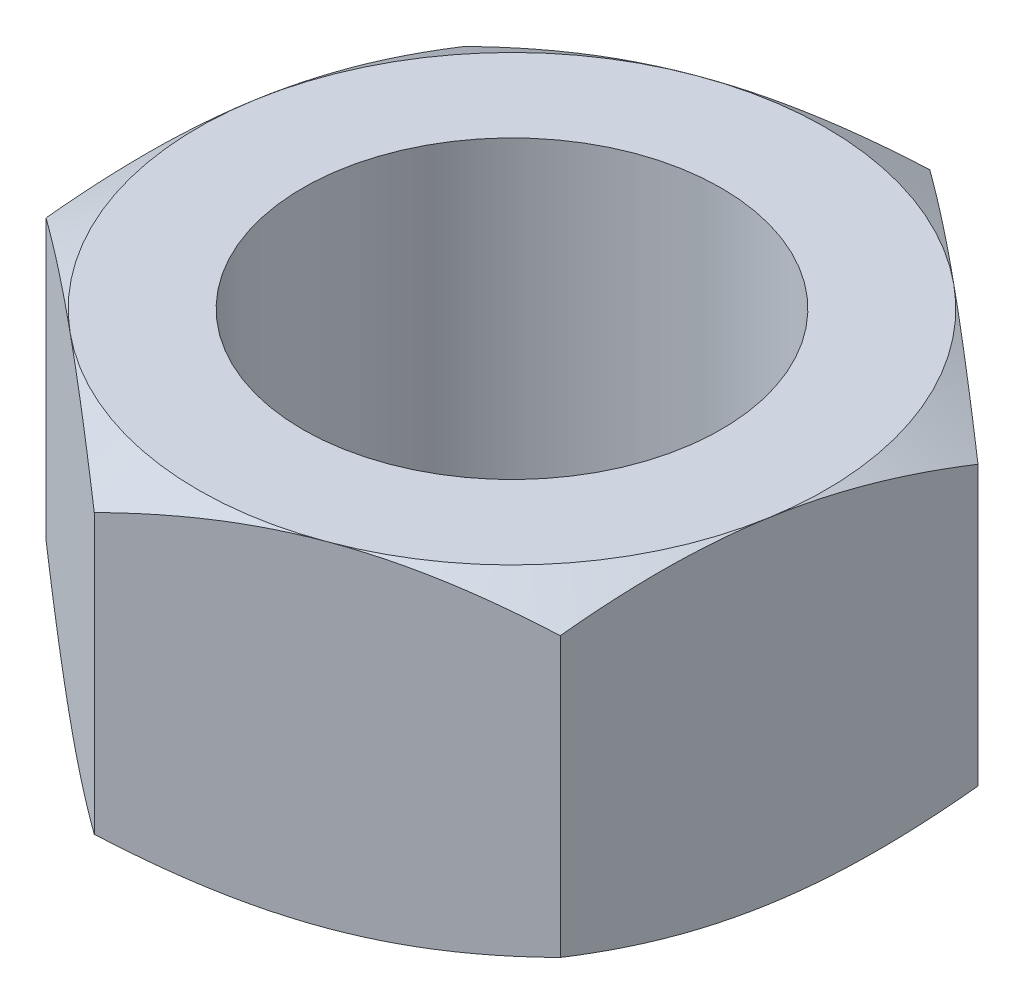
ISO-10303-21;
HEADER;
FILE_DESCRIPTION(('STEP AP214'),'2;1');
FILE_NAME('part.step','',(''),(''),'','','');
FILE_SCHEMA(('AUTOMOTIVE_DESIGN { 1 0 10303 214 1 1 1 1 }'));
ENDSEC;
DATA;
#1=APPLICATION_CONTEXT('core data for automotive mechanical design processes');
#2=APPLICATION_PROTOCOL_DEFINITION('international standard','automotive_design',2000,#1);
#3=PRODUCT_CONTEXT('',#1,'mechanical');
#4=PRODUCT('Part','Part','',(#3));
#5=PRODUCT_RELATED_PRODUCT_CATEGORY('part','',(#4));
#6=PRODUCT_DEFINITION_FORMATION('','',#4);
#7=PRODUCT_DEFINITION_CONTEXT('part definition',#1,'design');
#8=PRODUCT_DEFINITION('design','',#6,#7);
#9=PRODUCT_DEFINITION_SHAPE('','',#8);
#10=(LENGTH_UNIT() NAMED_UNIT(*) SI_UNIT(.MILLI.,.METRE.));
#11=(NAMED_UNIT(*) PLANE_ANGLE_UNIT() SI_UNIT($,.RADIAN.));
#12=(NAMED_UNIT(*) SI_UNIT($,.STERADIAN.) SOLID_ANGLE_UNIT());
#13=UNCERTAINTY_MEASURE_WITH_UNIT(LENGTH_MEASURE(1.E-05),#10,'distance_accuracy_value','');
#14=(GEOMETRIC_REPRESENTATION_CONTEXT(3) GLOBAL_UNCERTAINTY_ASSIGNED_CONTEXT((#13)) GLOBAL_UNIT_ASSIGNED_CONTEXT((#10,
#11,#12)) REPRESENTATION_CONTEXT('',''));
#15=CARTESIAN_POINT('',(0.,0.,0.));
#16=DIRECTION('',(0.,0.,1.));
#17=DIRECTION('',(1.,0.,0.));
#18=AXIS2_PLACEMENT_3D('',#15,#16,#17);
#19=CARTESIAN_POINT('',(-1.44369467023749,8.,8.53907171179209));
#20=DIRECTION('',(-0.34863406811952,0.,-0.937258921828133));
#21=DIRECTION('',(-0.937258921828133,0.,0.34863406811952));
#22=AXIS2_PLACEMENT_3D('',#19,#20,#21);
#23=PLANE('',#22);
#24=CARTESIAN_POINT('',(6.67340569203028,0.669934582085275,5.51973772123151));
#25=CARTESIAN_POINT('',(6.49498732644152,0.61499041368803,5.58610435607892));
#26=CARTESIAN_POINT('',(6.31590373120375,0.562539844764627,5.65271843772397));
#27=CARTESIAN_POINT('',(5.95628219341445,0.463312688605474,5.78648757748136));
#28=CARTESIAN_POINT('',(5.77574365902302,0.416538549046466,5.85364285574156));
#29=CARTESIAN_POINT('',(5.23123744179099,0.285648891076474,6.05618391799114));
#30=CARTESIAN_POINT('',(4.86512041892743,0.211200490063354,6.19236919627024));
#31=CARTESIAN_POINT('',(4.31723296252882,0.123901221271782,6.39616798478786));
#32=CARTESIAN_POINT('',(4.13709953241467,0.0990322370979437,6.46317257560309));
#33=CARTESIAN_POINT('',(3.77601876178583,0.0573306993877993,6.59748450910651));
#34=CARTESIAN_POINT('',(3.59507149461047,0.0404974357964017,6.66479182451452));
#35=CARTESIAN_POINT('',(3.23286270958824,0.0152963397422831,6.79952334777878));
#36=CARTESIAN_POINT('',(3.05160178328159,0.00691890019796405,6.86694733559865));
#37=CARTESIAN_POINT('',(2.68892251831363,-0.00119990207370901,7.0018538642255));
#38=CARTESIAN_POINT('',(2.50750418468866,-0.000941531608342203,7.0693364031591));
#39=CARTESIAN_POINT('',(2.01048216082673,0.0116366203444909,7.25421467541497));
#40=CARTESIAN_POINT('',(1.69504118336627,0.032750367326311,7.37154988414164));
#41=CARTESIAN_POINT('',(1.06625435166348,0.0997010500425559,7.60544097443817));
#42=CARTESIAN_POINT('',(0.752910708611471,0.145560867086196,7.72199603350715));
#43=CARTESIAN_POINT('',(0.122858541479935,0.260196634976687,7.95635779314358));
#44=CARTESIAN_POINT('',(-0.19377048564775,0.32945826489346,8.0741349230715));
#45=CARTESIAN_POINT('',(-0.822306823607496,0.486654039468555,8.30793283671146));
#46=CARTESIAN_POINT('',(-1.13422218333332,0.574551261711175,8.42395661438654));
#47=CARTESIAN_POINT('',(-1.44389467023749,0.669934582085275,8.53914610619048));
#48=B_SPLINE_CURVE_WITH_KNOTS('',3,(#24,#25,#26,#27,#28,#29,#30,#31,#32,#33,#34,#35,#36,#37,#38,
#39,#40,#41,#42,#43,#44,#45,#46,#47),.UNSPECIFIED.,.F.,.F.,(4,2,2,2,2,2,2,2,2,2,2,4),(0.,
0.594350167566524,1.18895571516085,2.38063749631713,2.96188394546358,3.54307902480116,
4.12361303374696,4.70412910684701,5.71472439101079,6.7262557214494,7.76022088252539,
8.79215629474527),.UNSPECIFIED.);
#49=CARTESIAN_POINT('',(6.67320569203028,0.669872981077802,5.5198121156299));
#50=VERTEX_POINT('',#49);
#51=CARTESIAN_POINT('',(2.6147555108964,0.,7.029441913711));
#52=VERTEX_POINT('',#51);
#53=EDGE_CURVE('E131',#50,#52,#48,.T.);
#54=ORIENTED_EDGE('',*,*,#53,.F.);
#55=DIRECTION('',(0.,-1.,0.));
#56=VECTOR('',#55,1.);
#57=CARTESIAN_POINT('',(6.67320569203028,8.,5.5198121156299));
#58=LINE('',#57,#56);
#59=CARTESIAN_POINT('',(6.67320569203028,7.3301270189222,5.5198121156299));
#60=VERTEX_POINT('',#59);
#61=EDGE_CURVE('E262',#60,#50,#58,.T.);
#62=ORIENTED_EDGE('',*,*,#61,.F.);
#63=CARTESIAN_POINT('',(-1.44389467023749,7.33006541791473,8.53914610619048));
#64=CARTESIAN_POINT('',(-1.26547630464873,7.38500958631197,8.47277947134307));
#65=CARTESIAN_POINT('',(-1.08639270941096,7.43746015523537,8.40616538969802));
#66=CARTESIAN_POINT('',(-0.726771171621659,7.53668731139453,8.27239624994063));
#67=CARTESIAN_POINT('',(-0.54623263723023,7.58346145095353,8.20524097168044));
#68=CARTESIAN_POINT('',(-0.00172641999819791,7.71435110892353,8.00269990943085));
#69=CARTESIAN_POINT('',(0.364390602865364,7.78879950993665,7.86651463115175));
#70=CARTESIAN_POINT('',(0.912278059263968,7.87609877872822,7.66271584263413));
#71=CARTESIAN_POINT('',(1.09241148937812,7.90096776290206,7.5957112518189));
#72=CARTESIAN_POINT('',(1.45349226000696,7.9426693006122,7.46139931831548));
#73=CARTESIAN_POINT('',(1.63443952718232,7.9595025642036,7.39409200290748));
#74=CARTESIAN_POINT('',(1.99664831220455,7.98470366025772,7.25936047964321));
#75=CARTESIAN_POINT('',(2.1779092385112,7.99308109980204,7.19193649182334));
#76=CARTESIAN_POINT('',(2.54058850347916,8.00119990207371,7.0570299631965));
#77=CARTESIAN_POINT('',(2.72200683710413,8.00094153160834,6.98954742426289));
#78=CARTESIAN_POINT('',(3.21902886096606,7.98836337965551,6.80466915200702));
#79=CARTESIAN_POINT('',(3.53446983842652,7.96724963267369,6.68733394328035));
#80=CARTESIAN_POINT('',(4.16325667012932,7.90029894995745,6.45344285298383));
#81=CARTESIAN_POINT('',(4.47660031318132,7.85443913291381,6.33688779391484));
#82=CARTESIAN_POINT('',(5.10665248031286,7.73980336502331,6.10252603427841));
#83=CARTESIAN_POINT('',(5.42328150744054,7.67054173510654,5.98474890435049));
#84=CARTESIAN_POINT('',(6.05181784540029,7.51334596053145,5.75095099071054));
#85=CARTESIAN_POINT('',(6.36373320512611,7.42544873828883,5.63492721303545));
#86=CARTESIAN_POINT('',(6.67340569203028,7.33006541791473,5.51973772123151));
#87=B_SPLINE_CURVE_WITH_KNOTS('',3,(#63,#64,#65,#66,#67,#68,#69,#70,#71,#72,#73,#74,#75,#76,#77,
#78,#79,#80,#81,#82,#83,#84,#85,#86),.UNSPECIFIED.,.F.,.F.,(4,2,2,2,2,2,2,2,2,2,2,4),(0.,
0.594350167566525,1.18895571516085,2.38063749631713,2.96188394546358,3.54307902480116,
4.12361303374695,4.704129106847,5.71472439101079,6.7262557214494,7.76022088252539,
8.79215629474526),.UNSPECIFIED.);
#88=CARTESIAN_POINT('',(2.6147555108964,8.,7.029441913711));
#89=VERTEX_POINT('',#88);
#90=EDGE_CURVE('E242',#89,#60,#87,.T.);
#91=ORIENTED_EDGE('',*,*,#90,.F.);
#92=CARTESIAN_POINT('',(-1.44369467023749,7.3301270189222,8.53907171179209));
#93=VERTEX_POINT('',#92);
#94=EDGE_CURVE('E248',#93,#89,#87,.T.);
#95=ORIENTED_EDGE('',*,*,#94,.F.);
#96=DIRECTION('',(0.,-1.,0.));
#97=VECTOR('',#96,1.);
#98=CARTESIAN_POINT('',(-1.44369467023749,8.,8.53907171179209));
#99=LINE('',#98,#97);
#100=CARTESIAN_POINT('',(-1.44369467023749,0.669872981077804,8.53907171179209));
#101=VERTEX_POINT('',#100);
#102=EDGE_CURVE('E161',#93,#101,#99,.T.);
#103=ORIENTED_EDGE('',*,*,#102,.T.);
#104=EDGE_CURVE('E143',#52,#101,#48,.T.);
#105=ORIENTED_EDGE('',*,*,#104,.F.);
#106=EDGE_LOOP('',(#54,#62,#91,#95,#103,#105));
#107=FACE_BOUND('',#106,.T.);
#108=ADVANCED_FACE('F41',(#107),#23,.F.);
#109=CARTESIAN_POINT('',(6.67320569203028,8.,5.5198121156299));
#110=DIRECTION('',(-0.986007070286536,0.,-0.166703501297848));
#111=DIRECTION('',(-0.166703501297848,0.,0.986007070286536));
#112=AXIS2_PLACEMENT_3D('',#109,#110,#111);
#113=PLANE('',#112);
#114=CARTESIAN_POINT('',(8.11693417612292,0.669931536480535,-3.01945959616219));
#115=CARTESIAN_POINT('',(8.08520019987834,0.614987494088027,-2.83176152922384));
#116=CARTESIAN_POINT('',(8.05334790409476,0.562537054216301,-2.64336363354107));
#117=CARTESIAN_POINT('',(7.98938463854219,0.463310161762978,-2.26503785404366));
#118=CARTESIAN_POINT('',(7.95727356350703,0.416536156859956,-2.07510934760759));
#119=CARTESIAN_POINT('',(7.86042620741353,0.285646912260097,-1.50228287963715));
#120=CARTESIAN_POINT('',(7.79530763940616,0.211198797092288,-1.1171237920216));
#121=CARTESIAN_POINT('',(7.69785888875528,0.123899954229493,-0.54074023448197));
#122=CARTESIAN_POINT('',(7.66581986681431,0.0990311093659153,-0.351237903019766));
#123=CARTESIAN_POINT('',(7.60159705945798,0.0573298489513181,0.0286229975251618));
#124=CARTESIAN_POINT('',(7.56941328708685,0.0404967233463565,0.218981489454664));
#125=CARTESIAN_POINT('',(7.50498984963335,0.01529589836571,0.600029063901351));
#126=CARTESIAN_POINT('',(7.47275028976229,0.00691859196391458,0.790717524121497));
#127=CARTESIAN_POINT('',(7.40824317319374,-0.00119995198440781,1.17226003837705));
#128=CARTESIAN_POINT('',(7.37597561739202,-0.000941456342233855,1.36311408711426));
#129=CARTESIAN_POINT('',(7.2875741645718,0.0116369901313172,1.88598527353643));
#130=CARTESIAN_POINT('',(7.23146920871259,0.0327507878641885,2.21783123192727));
#131=CARTESIAN_POINT('',(7.11963193933104,0.0997013333310603,2.87931906795497));
#132=CARTESIAN_POINT('',(7.06390001908873,0.145560961828871,3.20895861944455));
#133=CARTESIAN_POINT('',(6.95183769884847,0.260196141216312,3.87177757171231));
#134=CARTESIAN_POINT('',(6.89552143817182,0.329457363606809,4.20487334214886));
#135=CARTESIAN_POINT('',(6.78372872548718,0.486652168279931,4.86609763711207));
#136=CARTESIAN_POINT('',(6.72825084191222,0.574548828915974,5.19423462897829));
#137=CARTESIAN_POINT('',(6.67317187817512,0.669931536480536,5.5200121156299));
#138=B_SPLINE_CURVE_WITH_KNOTS('',3,(#114,#115,#116,#117,#118,#119,#120,#121,#122,#123,#124,
#125,#126,#127,#128,#129,#130,#131,#132,#133,#134,#135,#136,#137),.UNSPECIFIED.,.F.,.F.,(4,2,2,
2,2,2,2,2,2,2,2,4),(0.,0.594349806644114,1.1889549931035,2.380636032122,2.96188215456027,
3.54307690729336,4.12361059346092,4.70412634350593,5.71471695893529,6.72624360304106,
7.76020382983172,8.79213434275382),.UNSPECIFIED.);
#139=CARTESIAN_POINT('',(8.11690036226776,0.669872981077801,-3.01925959616219));
#140=VERTEX_POINT('',#139);
#141=CARTESIAN_POINT('',(7.39505302714902,0.,1.25027625973386));
#142=VERTEX_POINT('',#141);
#143=EDGE_CURVE('E58',#140,#142,#138,.T.);
#144=ORIENTED_EDGE('',*,*,#143,.F.);
#145=DIRECTION('',(0.,-1.,0.));
#146=VECTOR('',#145,1.);
#147=CARTESIAN_POINT('',(8.11690036226776,8.,-3.01925959616219));
#148=LINE('',#147,#146);
#149=CARTESIAN_POINT('',(8.11690036226776,7.3301270189222,-3.01925959616219));
#150=VERTEX_POINT('',#149);
#151=EDGE_CURVE('E259',#150,#140,#148,.T.);
#152=ORIENTED_EDGE('',*,*,#151,.F.);
#153=CARTESIAN_POINT('',(6.67317187817512,7.33006846351947,5.5200121156299));
#154=CARTESIAN_POINT('',(6.7049058544197,7.38501250591197,5.33231404869155));
#155=CARTESIAN_POINT('',(6.73675815020328,7.4374629457837,5.14391615300878));
#156=CARTESIAN_POINT('',(6.80072141575585,7.53668983823702,4.76559037351137));
#157=CARTESIAN_POINT('',(6.83283249079101,7.58346384314005,4.57566186707531));
#158=CARTESIAN_POINT('',(6.92967984688451,7.71435308773991,4.00283539910487));
#159=CARTESIAN_POINT('',(6.99479841489188,7.78880120290771,3.61767631148931));
#160=CARTESIAN_POINT('',(7.09224716554276,7.87610004577051,3.04129275394969));
#161=CARTESIAN_POINT('',(7.12428618748373,7.90096889063409,2.85179042248748));
#162=CARTESIAN_POINT('',(7.18850899484006,7.94267015104868,2.47192952194255));
#163=CARTESIAN_POINT('',(7.22069276721119,7.95950327665365,2.28157103001305));
#164=CARTESIAN_POINT('',(7.28511620466469,7.98470410163429,1.90052345556636));
#165=CARTESIAN_POINT('',(7.31735576453575,7.99308140803609,1.70983499534622));
#166=CARTESIAN_POINT('',(7.3818628811043,8.00119995198441,1.32829248109066));
#167=CARTESIAN_POINT('',(7.41413043690602,8.00094145634224,1.13743843235345));
#168=CARTESIAN_POINT('',(7.50253188972624,7.98836300986868,0.614567245931289));
#169=CARTESIAN_POINT('',(7.55863684558545,7.96724921213581,0.282721287540443));
#170=CARTESIAN_POINT('',(7.670474114967,7.90029866666894,-0.378766548487257));
#171=CARTESIAN_POINT('',(7.72620603520931,7.85443903817113,-0.708406099976839));
#172=CARTESIAN_POINT('',(7.83826835544957,7.73980385878369,-1.3712250522446));
#173=CARTESIAN_POINT('',(7.89458461612622,7.67054263639319,-1.70432082268115));
#174=CARTESIAN_POINT('',(8.00637732881086,7.51334783172007,-2.36554511764435));
#175=CARTESIAN_POINT('',(8.06185521238582,7.42545117108403,-2.69368210951058));
#176=CARTESIAN_POINT('',(8.11693417612292,7.33006846351947,-3.01945959616219));
#177=B_SPLINE_CURVE_WITH_KNOTS('',3,(#153,#154,#155,#156,#157,#158,#159,#160,#161,#162,#163,
#164,#165,#166,#167,#168,#169,#170,#171,#172,#173,#174,#175,#176),.UNSPECIFIED.,.F.,.F.,(4,2,2,
2,2,2,2,2,2,2,2,4),(0.,0.594349806644116,1.18895499310351,2.380636032122,2.96188215456027,
3.54307690729336,4.12361059346092,4.70412634350593,5.71471695893529,6.72624360304106,
7.76020382983172,8.79213434275382),.UNSPECIFIED.);
#178=CARTESIAN_POINT('',(7.39505302714903,8.,1.25027625973386));
#179=VERTEX_POINT('',#178);
#180=EDGE_CURVE('E227',#179,#150,#177,.T.);
#181=ORIENTED_EDGE('',*,*,#180,.F.);
#182=EDGE_CURVE('E234',#60,#179,#177,.T.);
#183=ORIENTED_EDGE('',*,*,#182,.F.);
#184=ORIENTED_EDGE('',*,*,#61,.T.);
#185=EDGE_CURVE('E137',#142,#50,#138,.T.);
#186=ORIENTED_EDGE('',*,*,#185,.F.);
#187=EDGE_LOOP('',(#144,#152,#181,#183,#184,#186));
#188=FACE_BOUND('',#187,.T.);
#189=ADVANCED_FACE('F219',(#188),#113,.F.);
#190=CARTESIAN_POINT('',(8.11690036226776,8.,-3.01925959616219));
#191=DIRECTION('',(-0.637373002167017,0.,0.770555420530285));
#192=DIRECTION('',(0.770555420530285,0.,0.637373002167017));
#193=AXIS2_PLACEMENT_3D('',#190,#191,#192);
#194=PLANE('',#193);
#195=CARTESIAN_POINT('',(1.44349467023748,0.669947909270021,-8.53923714389085));
#196=CARTESIAN_POINT('',(1.59017934429502,0.615003189494996,-8.41790537646055));
#197=CARTESIAN_POINT('',(1.73741092985964,0.56255205586088,-8.29612122543796));
#198=CARTESIAN_POINT('',(2.03306978023781,0.463323745764642,-8.05156390475479));
#199=CARTESIAN_POINT('',(2.18149753162802,0.416549016971252,-7.9287903326172));
#200=CARTESIAN_POINT('',(2.62915730228068,0.2856575501553,-7.55850385565761));
#201=CARTESIAN_POINT('',(2.93015638802545,0.211207898325488,-7.30952930325144));
#202=CARTESIAN_POINT('',(3.38059604417727,0.123906765731987,-6.93694341482957));
#203=CARTESIAN_POINT('',(3.52869074651668,0.0990371719568291,-6.81444532770932));
#204=CARTESIAN_POINT('',(3.82554931567242,0.0573344208415768,-6.56889564704964));
#205=CARTESIAN_POINT('',(3.97431312219173,0.0405005534413595,-6.44584410338552));
#206=CARTESIAN_POINT('',(4.27209910847214,0.0152982712082999,-6.19952729991901));
#207=CARTESIAN_POINT('',(4.42112080187179,0.00692024905105385,-6.0762624424156));
#208=CARTESIAN_POINT('',(4.71929362297594,-0.00119968360760581,-5.82962566446526));
#209=CARTESIAN_POINT('',(4.86844474653955,-0.000941860898707517,-5.7062537474435));
#210=CARTESIAN_POINT('',(5.27707067658354,0.011635002250856,-5.36825452135774));
#211=CARTESIAN_POINT('',(5.53641172314485,0.0327485271370408,-5.15373785321444));
#212=CARTESIAN_POINT('',(6.05337129392387,0.0996998104171765,-4.72612931936019));
#213=CARTESIAN_POINT('',(6.31098800006821,0.14556045250706,-4.51303895748772));
#214=CARTESIAN_POINT('',(6.82898795637013,0.260198795605914,-4.08456985783058));
#215=CARTESIAN_POINT('',(7.0893058444828,0.329462208806821,-3.86924518494727));
#216=CARTESIAN_POINT('',(7.60605953930169,0.486662227553499,-3.44180694355387));
#217=CARTESIAN_POINT('',(7.86250196394722,0.574561907317877,-3.22968790094584));
#218=CARTESIAN_POINT('',(8.11710036226776,0.66994790927002,-3.01909416406342));
#219=B_SPLINE_CURVE_WITH_KNOTS('',3,(#195,#196,#197,#198,#199,#200,#201,#202,#203,#204,#205,
#206,#207,#208,#209,#210,#211,#212,#213,#214,#215,#216,#217,#218),.UNSPECIFIED.,.F.,.F.,(4,2,2,
2,2,2,2,2,2,2,2,4),(0.,0.594351746917321,1.18895887479238,2.38064390344968,2.96189178223027,
3.54308829074832,4.12362371213127,4.70414119887973,5.71475691272487,6.72630874985524,
7.76029550264454,8.792252353473),.UNSPECIFIED.);
#220=CARTESIAN_POINT('',(1.44369467023748,0.669872981077803,-8.53907171179209));
#221=VERTEX_POINT('',#220);
#222=CARTESIAN_POINT('',(4.78029751625262,0.,-5.77916565397714));
#223=VERTEX_POINT('',#222);
#224=EDGE_CURVE('E65',#221,#223,#219,.T.);
#225=ORIENTED_EDGE('',*,*,#224,.F.);
#226=DIRECTION('',(0.,-1.,0.));
#227=VECTOR('',#226,1.);
#228=CARTESIAN_POINT('',(1.44369467023748,8.,-8.53907171179209));
#229=LINE('',#228,#227);
#230=CARTESIAN_POINT('',(1.44369467023748,7.3301270189222,-8.53907171179209));
#231=VERTEX_POINT('',#230);
#232=EDGE_CURVE('E256',#231,#221,#229,.T.);
#233=ORIENTED_EDGE('',*,*,#232,.F.);
#234=CARTESIAN_POINT('',(8.11710036226776,7.33005209072998,-3.01909416406342));
#235=CARTESIAN_POINT('',(7.97041568821022,7.38499681050501,-3.14042593149373));
#236=CARTESIAN_POINT('',(7.82318410264561,7.43744794413912,-3.26221008251631));
#237=CARTESIAN_POINT('',(7.52752525226744,7.53667625423536,-3.50676740319948));
#238=CARTESIAN_POINT('',(7.37909750087722,7.58345098302875,-3.62954097533707));
#239=CARTESIAN_POINT('',(6.93143773022457,7.7143424498447,-3.99982745229667));
#240=CARTESIAN_POINT('',(6.63043864447979,7.78879210167451,-4.24880200470283));
#241=CARTESIAN_POINT('',(6.17999898832797,7.87609323426802,-4.62138789312471));
#242=CARTESIAN_POINT('',(6.03190428598856,7.90096282804317,-4.74388598024496));
#243=CARTESIAN_POINT('',(5.73504571683282,7.94266557915843,-4.98943566090464));
#244=CARTESIAN_POINT('',(5.58628191031352,7.95949944655864,-5.11248720456875));
#245=CARTESIAN_POINT('',(5.28849592403311,7.9847017287917,-5.35880400803526));
#246=CARTESIAN_POINT('',(5.13947423063345,7.99307975094895,-5.48206886553868));
#247=CARTESIAN_POINT('',(4.8413014095293,8.00119968360761,-5.72870564348902));
#248=CARTESIAN_POINT('',(4.69215028596569,8.00094186089871,-5.85207756051077));
#249=CARTESIAN_POINT('',(4.2835243559217,7.98836499774915,-6.19007678659654));
#250=CARTESIAN_POINT('',(4.02418330936039,7.96725147286296,-6.40459345473984));
#251=CARTESIAN_POINT('',(3.50722373858137,7.90030018958282,-6.83220198859408));
#252=CARTESIAN_POINT('',(3.24960703243704,7.85443954749294,-7.04529235046655));
#253=CARTESIAN_POINT('',(2.73160707613511,7.73980120439409,-7.47376145012369));
#254=CARTESIAN_POINT('',(2.47128918802245,7.67053779119318,-7.68908612300701));
#255=CARTESIAN_POINT('',(1.95453549320356,7.5133377724465,-8.1165243644004));
#256=CARTESIAN_POINT('',(1.69809306855803,7.42543809268213,-8.32864340700843));
#257=CARTESIAN_POINT('',(1.44349467023748,7.33005209072998,-8.53923714389085));
#258=B_SPLINE_CURVE_WITH_KNOTS('',3,(#234,#235,#236,#237,#238,#239,#240,#241,#242,#243,#244,
#245,#246,#247,#248,#249,#250,#251,#252,#253,#254,#255,#256,#257),.UNSPECIFIED.,.F.,.F.,(4,2,2,
2,2,2,2,2,2,2,2,4),(0.,0.594351746917323,1.18895887479238,2.38064390344967,2.96189178223027,
3.54308829074832,4.12362371213127,4.70414119887973,5.71475691272487,6.72630874985524,
7.76029550264454,8.79225235347299),.UNSPECIFIED.);
#259=CARTESIAN_POINT('',(4.78029751625262,8.,-5.77916565397714));
#260=VERTEX_POINT('',#259);
#261=EDGE_CURVE('E236',#260,#231,#258,.T.);
#262=ORIENTED_EDGE('',*,*,#261,.F.);
#263=EDGE_CURVE('E235',#150,#260,#258,.T.);
#264=ORIENTED_EDGE('',*,*,#263,.F.);
#265=ORIENTED_EDGE('',*,*,#151,.T.);
#266=EDGE_CURVE('E212',#223,#140,#219,.T.);
#267=ORIENTED_EDGE('',*,*,#266,.F.);
#268=EDGE_LOOP('',(#225,#233,#262,#264,#265,#267));
#269=FACE_BOUND('',#268,.T.);
#270=ADVANCED_FACE('F222',(#269),#194,.F.);
#271=CARTESIAN_POINT('',(1.44369467023748,8.,-8.53907171179209));
#272=DIRECTION('',(0.34863406811952,0.,0.937258921828133));
#273=DIRECTION('',(0.937258921828133,0.,-0.34863406811952));
#274=AXIS2_PLACEMENT_3D('',#271,#272,#273);
#275=PLANE('',#274);
#276=CARTESIAN_POINT('',(-6.67340569203028,0.669934582085276,-5.51973772123152));
#277=CARTESIAN_POINT('',(-6.49498732644152,0.614990413688031,-5.58610435607893));
#278=CARTESIAN_POINT('',(-6.31590373120376,0.562539844764629,-5.65271843772398));
#279=CARTESIAN_POINT('',(-5.95628219341445,0.463312688605475,-5.78648757748136));
#280=CARTESIAN_POINT('',(-5.77574365902302,0.416538549046468,-5.85364285574156));
#281=CARTESIAN_POINT('',(-5.23123744179099,0.285648891076476,-6.05618391799115));
#282=CARTESIAN_POINT('',(-4.86512041892743,0.211200490063354,-6.19236919627024));
#283=CARTESIAN_POINT('',(-4.31723296252883,0.123901221271783,-6.39616798478786));
#284=CARTESIAN_POINT('',(-4.13709953241468,0.0990322370979448,-6.46317257560309));
#285=CARTESIAN_POINT('',(-3.77601876178583,0.0573306993878005,-6.59748450910651));
#286=CARTESIAN_POINT('',(-3.59507149461047,0.0404974357964028,-6.66479182451452));
#287=CARTESIAN_POINT('',(-3.23286270958824,0.0152963397422842,-6.79952334777878));
#288=CARTESIAN_POINT('',(-3.05160178328159,0.00691890019796537,-6.86694733559865));
#289=CARTESIAN_POINT('',(-2.68892251831363,-0.00119990207370781,-7.0018538642255));
#290=CARTESIAN_POINT('',(-2.50750418468866,-0.00094153160834132,-7.0693364031591));
#291=CARTESIAN_POINT('',(-2.01048216082673,0.0116366203444915,-7.25421467541497));
#292=CARTESIAN_POINT('',(-1.69504118336627,0.0327503673263118,-7.37154988414164));
#293=CARTESIAN_POINT('',(-1.06625435166348,0.0997010500425568,-7.60544097443817));
#294=CARTESIAN_POINT('',(-0.752910708611473,0.145560867086196,-7.72199603350715));
#295=CARTESIAN_POINT('',(-0.122858541479938,0.260196634976688,-7.95635779314358));
#296=CARTESIAN_POINT('',(0.193770485647746,0.329458264893461,-8.0741349230715));
#297=CARTESIAN_POINT('',(0.822306823607491,0.486654039468555,-8.30793283671146));
#298=CARTESIAN_POINT('',(1.13422218333331,0.574551261711174,-8.42395661438654));
#299=CARTESIAN_POINT('',(1.44389467023748,0.669934582085274,-8.53914610619048));
#300=B_SPLINE_CURVE_WITH_KNOTS('',3,(#276,#277,#278,#279,#280,#281,#282,#283,#284,#285,#286,
#287,#288,#289,#290,#291,#292,#293,#294,#295,#296,#297,#298,#299),.UNSPECIFIED.,.F.,.F.,(4,2,2,
2,2,2,2,2,2,2,2,4),(0.,0.594350167566525,1.18895571516085,2.38063749631713,2.96188394546358,
3.54307902480116,4.12361303374696,4.70412910684701,5.71472439101079,6.7262557214494,
7.76022088252539,8.79215629474526),.UNSPECIFIED.);
#301=CARTESIAN_POINT('',(-6.67320569203028,0.669872981077804,-5.5198121156299));
#302=VERTEX_POINT('',#301);
#303=CARTESIAN_POINT('',(-2.6147555108964,0.,-7.029441913711));
#304=VERTEX_POINT('',#303);
#305=EDGE_CURVE('E176',#302,#304,#300,.T.);
#306=ORIENTED_EDGE('',*,*,#305,.F.);
#307=DIRECTION('',(0.,-1.,0.));
#308=VECTOR('',#307,1.);
#309=CARTESIAN_POINT('',(-6.67320569203028,8.,-5.5198121156299));
#310=LINE('',#309,#308);
#311=CARTESIAN_POINT('',(-6.67320569203028,7.3301270189222,-5.5198121156299));
#312=VERTEX_POINT('',#311);
#313=EDGE_CURVE('E253',#312,#302,#310,.T.);
#314=ORIENTED_EDGE('',*,*,#313,.F.);
#315=CARTESIAN_POINT('',(1.44389467023748,7.33006541791473,-8.53914610619048));
#316=CARTESIAN_POINT('',(1.26547630464873,7.38500958631197,-8.47277947134307));
#317=CARTESIAN_POINT('',(1.08639270941096,7.43746015523537,-8.40616538969802));
#318=CARTESIAN_POINT('',(0.726771171621654,7.53668731139453,-8.27239624994063));
#319=CARTESIAN_POINT('',(0.546232637230224,7.58346145095354,-8.20524097168044));
#320=CARTESIAN_POINT('',(0.00172641999819325,7.71435110892353,-8.00269990943085));
#321=CARTESIAN_POINT('',(-0.364390602865369,7.78879950993665,-7.86651463115175));
#322=CARTESIAN_POINT('',(-0.912278059263972,7.87609877872822,-7.66271584263413));
#323=CARTESIAN_POINT('',(-1.09241148937812,7.90096776290206,-7.5957112518189));
#324=CARTESIAN_POINT('',(-1.45349226000697,7.9426693006122,-7.46139931831548));
#325=CARTESIAN_POINT('',(-1.63443952718233,7.9595025642036,-7.39409200290748));
#326=CARTESIAN_POINT('',(-1.99664831220456,7.98470366025772,-7.25936047964321));
#327=CARTESIAN_POINT('',(-2.17790923851121,7.99308109980204,-7.19193649182334));
#328=CARTESIAN_POINT('',(-2.54058850347917,8.00119990207371,-7.0570299631965));
#329=CARTESIAN_POINT('',(-2.72200683710413,8.00094153160834,-6.98954742426289));
#330=CARTESIAN_POINT('',(-3.21902886096607,7.98836337965551,-6.80466915200702));
#331=CARTESIAN_POINT('',(-3.53446983842653,7.96724963267369,-6.68733394328035));
#332=CARTESIAN_POINT('',(-4.16325667012932,7.90029894995744,-6.45344285298383));
#333=CARTESIAN_POINT('',(-4.47660031318133,7.8544391329138,-6.33688779391484));
#334=CARTESIAN_POINT('',(-5.10665248031286,7.73980336502331,-6.10252603427841));
#335=CARTESIAN_POINT('',(-5.42328150744054,7.67054173510654,-5.98474890435049));
#336=CARTESIAN_POINT('',(-6.05181784540029,7.51334596053145,-5.75095099071054));
#337=CARTESIAN_POINT('',(-6.36373320512611,7.42544873828883,-5.63492721303545));
#338=CARTESIAN_POINT('',(-6.67340569203028,7.33006541791473,-5.51973772123152));
#339=B_SPLINE_CURVE_WITH_KNOTS('',3,(#315,#316,#317,#318,#319,#320,#321,#322,#323,#324,#325,
#326,#327,#328,#329,#330,#331,#332,#333,#334,#335,#336,#337,#338),.UNSPECIFIED.,.F.,.F.,(4,2,2,
2,2,2,2,2,2,2,2,4),(0.,0.594350167566525,1.18895571516085,2.38063749631713,2.96188394546358,
3.54307902480116,4.12361303374696,4.70412910684701,5.71472439101079,6.7262557214494,
7.76022088252539,8.79215629474526),.UNSPECIFIED.);
#340=CARTESIAN_POINT('',(-2.6147555108964,8.,-7.029441913711));
#341=VERTEX_POINT('',#340);
#342=EDGE_CURVE('E298',#341,#312,#339,.T.);
#343=ORIENTED_EDGE('',*,*,#342,.F.);
#344=EDGE_CURVE('E465',#231,#341,#339,.T.);
#345=ORIENTED_EDGE('',*,*,#344,.F.);
#346=ORIENTED_EDGE('',*,*,#232,.T.);
#347=EDGE_CURVE('E444',#304,#221,#300,.T.);
#348=ORIENTED_EDGE('',*,*,#347,.F.);
#349=EDGE_LOOP('',(#306,#314,#343,#345,#346,#348));
#350=FACE_BOUND('',#349,.T.);
#351=ADVANCED_FACE('F316',(#350),#275,.F.);
#352=CARTESIAN_POINT('',(-6.67320569203028,8.,-5.5198121156299));
#353=DIRECTION('',(0.986007070286536,0.,0.166703501297848));
#354=DIRECTION('',(0.166703501297848,0.,-0.986007070286536));
#355=AXIS2_PLACEMENT_3D('',#352,#353,#354);
#356=PLANE('',#355);
#357=CARTESIAN_POINT('',(-8.11693417612292,0.669931536480537,3.01945959616219));
#358=CARTESIAN_POINT('',(-8.08520019987835,0.61498749408803,2.83176152922384));
#359=CARTESIAN_POINT('',(-8.05334790409477,0.562537054216303,2.64336363354107));
#360=CARTESIAN_POINT('',(-7.98938463854219,0.46331016176298,2.26503785404365));
#361=CARTESIAN_POINT('',(-7.95727356350704,0.416536156859958,2.07510934760759));
#362=CARTESIAN_POINT('',(-7.86042620741353,0.285646912260098,1.50228287963715));
#363=CARTESIAN_POINT('',(-7.79530763940617,0.21119879709229,1.1171237920216));
#364=CARTESIAN_POINT('',(-7.69785888875528,0.123899954229495,0.540740234481968));
#365=CARTESIAN_POINT('',(-7.66581986681432,0.0990311093659176,0.351237903019765));
#366=CARTESIAN_POINT('',(-7.60159705945799,0.0573298489513206,-0.0286229975251638));
#367=CARTESIAN_POINT('',(-7.56941328708686,0.040496723346359,-0.218981489454666));
#368=CARTESIAN_POINT('',(-7.50498984963335,0.0152958983657123,-0.600029063901353));
#369=CARTESIAN_POINT('',(-7.47275028976229,0.00691859196391657,-0.790717524121499));
#370=CARTESIAN_POINT('',(-7.40824317319375,-0.00119995198440554,-1.17226003837705));
#371=CARTESIAN_POINT('',(-7.37597561739202,-0.000941456342231071,-1.36311408711427));
#372=CARTESIAN_POINT('',(-7.28757416457181,0.0116369901313206,-1.88598527353643));
#373=CARTESIAN_POINT('',(-7.2314692087126,0.0327507878641913,-2.21783123192727));
#374=CARTESIAN_POINT('',(-7.11963193933104,0.0997013333310626,-2.87931906795497));
#375=CARTESIAN_POINT('',(-7.06390001908873,0.145560961828873,-3.20895861944456));
#376=CARTESIAN_POINT('',(-6.95183769884847,0.260196141216314,-3.87177757171231));
#377=CARTESIAN_POINT('',(-6.89552143817182,0.329457363606811,-4.20487334214886));
#378=CARTESIAN_POINT('',(-6.78372872548718,0.486652168279932,-4.86609763711207));
#379=CARTESIAN_POINT('',(-6.72825084191222,0.574548828915975,-5.19423462897829));
#380=CARTESIAN_POINT('',(-6.67317187817512,0.669931536480537,-5.5200121156299));
#381=B_SPLINE_CURVE_WITH_KNOTS('',3,(#357,#358,#359,#360,#361,#362,#363,#364,#365,#366,#367,
#368,#369,#370,#371,#372,#373,#374,#375,#376,#377,#378,#379,#380),.UNSPECIFIED.,.F.,.F.,(4,2,2,
2,2,2,2,2,2,2,2,4),(0.,0.594349806644116,1.18895499310351,2.380636032122,2.96188215456027,
3.54307690729336,4.12361059346092,4.70412634350593,5.71471695893529,6.72624360304106,
7.76020382983172,8.79213434275382),.UNSPECIFIED.);
#382=CARTESIAN_POINT('',(-8.11690036226777,0.669872981077805,3.01925959616219));
#383=VERTEX_POINT('',#382);
#384=CARTESIAN_POINT('',(-7.39505302714902,0.,-1.25027625973386));
#385=VERTEX_POINT('',#384);
#386=EDGE_CURVE('E162',#383,#385,#381,.T.);
#387=ORIENTED_EDGE('',*,*,#386,.F.);
#388=DIRECTION('',(0.,-1.,0.));
#389=VECTOR('',#388,1.);
#390=CARTESIAN_POINT('',(-8.11690036226777,8.,3.01925959616219));
#391=LINE('',#390,#389);
#392=CARTESIAN_POINT('',(-8.11690036226777,7.3301270189222,3.01925959616219));
#393=VERTEX_POINT('',#392);
#394=EDGE_CURVE('E250',#393,#383,#391,.T.);
#395=ORIENTED_EDGE('',*,*,#394,.F.);
#396=CARTESIAN_POINT('',(-6.67317187817512,7.33006846351946,-5.5200121156299));
#397=CARTESIAN_POINT('',(-6.7049058544197,7.38501250591197,-5.33231404869155));
#398=CARTESIAN_POINT('',(-6.73675815020328,7.4374629457837,-5.14391615300879));
#399=CARTESIAN_POINT('',(-6.80072141575586,7.53668983823702,-4.76559037351137));
#400=CARTESIAN_POINT('',(-6.83283249079101,7.58346384314004,-4.57566186707531));
#401=CARTESIAN_POINT('',(-6.92967984688451,7.7143530877399,-4.00283539910487));
#402=CARTESIAN_POINT('',(-6.99479841489188,7.78880120290771,-3.61767631148931));
#403=CARTESIAN_POINT('',(-7.09224716554277,7.87610004577051,-3.04129275394969));
#404=CARTESIAN_POINT('',(-7.12428618748373,7.90096889063408,-2.85179042248748));
#405=CARTESIAN_POINT('',(-7.18850899484006,7.94267015104868,-2.47192952194255));
#406=CARTESIAN_POINT('',(-7.22069276721119,7.95950327665364,-2.28157103001305));
#407=CARTESIAN_POINT('',(-7.28511620466469,7.98470410163429,-1.90052345556636));
#408=CARTESIAN_POINT('',(-7.31735576453576,7.99308140803609,-1.70983499534622));
#409=CARTESIAN_POINT('',(-7.3818628811043,8.00119995198441,-1.32829248109066));
#410=CARTESIAN_POINT('',(-7.41413043690603,8.00094145634223,-1.13743843235345));
#411=CARTESIAN_POINT('',(-7.50253188972624,7.98836300986868,-0.614567245931289));
#412=CARTESIAN_POINT('',(-7.55863684558545,7.96724921213581,-0.282721287540444));
#413=CARTESIAN_POINT('',(-7.67047411496701,7.90029866666894,0.378766548487257));
#414=CARTESIAN_POINT('',(-7.72620603520932,7.85443903817113,0.708406099976839));
#415=CARTESIAN_POINT('',(-7.83826835544957,7.73980385878369,1.3712250522446));
#416=CARTESIAN_POINT('',(-7.89458461612622,7.67054263639319,1.70432082268115));
#417=CARTESIAN_POINT('',(-8.00637732881086,7.51334783172007,2.36554511764435));
#418=CARTESIAN_POINT('',(-8.06185521238582,7.42545117108403,2.69368210951057));
#419=CARTESIAN_POINT('',(-8.11693417612292,7.33006846351946,3.01945959616219));
#420=B_SPLINE_CURVE_WITH_KNOTS('',3,(#396,#397,#398,#399,#400,#401,#402,#403,#404,#405,#406,
#407,#408,#409,#410,#411,#412,#413,#414,#415,#416,#417,#418,#419),.UNSPECIFIED.,.F.,.F.,(4,2,2,
2,2,2,2,2,2,2,2,4),(0.,0.594349806644115,1.18895499310351,2.380636032122,2.96188215456028,
3.54307690729336,4.12361059346092,4.70412634350593,5.71471695893529,6.72624360304106,
7.76020382983172,8.79213434275382),.UNSPECIFIED.);
#421=CARTESIAN_POINT('',(-7.39505302714903,8.,-1.25027625973386));
#422=VERTEX_POINT('',#421);
#423=EDGE_CURVE('E288',#422,#393,#420,.T.);
#424=ORIENTED_EDGE('',*,*,#423,.F.);
#425=EDGE_CURVE('E291',#312,#422,#420,.T.);
#426=ORIENTED_EDGE('',*,*,#425,.F.);
#427=ORIENTED_EDGE('',*,*,#313,.T.);
#428=EDGE_CURVE('E142',#385,#302,#381,.T.);
#429=ORIENTED_EDGE('',*,*,#428,.F.);
#430=EDGE_LOOP('',(#387,#395,#424,#426,#427,#429));
#431=FACE_BOUND('',#430,.T.);
#432=ADVANCED_FACE('F290',(#431),#356,.F.);
#433=CARTESIAN_POINT('',(-8.11690036226777,8.,3.01925959616219));
#434=DIRECTION('',(0.637373002167017,0.,-0.770555420530285));
#435=DIRECTION('',(-0.770555420530285,0.,-0.637373002167017));
#436=AXIS2_PLACEMENT_3D('',#433,#434,#435);
#437=PLANE('',#436);
#438=CARTESIAN_POINT('',(-1.44349467023749,0.669947909270022,8.53923714389085));
#439=CARTESIAN_POINT('',(-1.59017934429503,0.615003189494997,8.41790537646054));
#440=CARTESIAN_POINT('',(-1.73741092985964,0.56255205586088,8.29612122543796));
#441=CARTESIAN_POINT('',(-2.03306978023781,0.463323745764642,8.05156390475479));
#442=CARTESIAN_POINT('',(-2.18149753162803,0.416549016971254,7.9287903326172));
#443=CARTESIAN_POINT('',(-2.62915730228069,0.285657550155301,7.55850385565761));
#444=CARTESIAN_POINT('',(-2.93015638802546,0.21120789832549,7.30952930325144));
#445=CARTESIAN_POINT('',(-3.38059604417728,0.123906765731988,6.93694341482957));
#446=CARTESIAN_POINT('',(-3.52869074651669,0.0990371719568305,6.81444532770932));
#447=CARTESIAN_POINT('',(-3.82554931567243,0.0573344208415784,6.56889564704964));
#448=CARTESIAN_POINT('',(-3.97431312219174,0.0405005534413615,6.44584410338552));
#449=CARTESIAN_POINT('',(-4.27209910847214,0.0152982712083024,6.19952729991901));
#450=CARTESIAN_POINT('',(-4.4211208018718,0.00692024905105637,6.07626244241559));
#451=CARTESIAN_POINT('',(-4.71929362297595,-0.00119968360760332,5.82962566446526));
#452=CARTESIAN_POINT('',(-4.86844474653956,-0.000941860898705065,5.7062537474435));
#453=CARTESIAN_POINT('',(-5.27707067658355,0.0116350022508586,5.36825452135774));
#454=CARTESIAN_POINT('',(-5.53641172314486,0.0327485271370437,5.15373785321444));
#455=CARTESIAN_POINT('',(-6.05337129392388,0.0996998104171793,4.72612931936019));
#456=CARTESIAN_POINT('',(-6.31098800006821,0.145560452507062,4.51303895748772));
#457=CARTESIAN_POINT('',(-6.82898795637014,0.260198795605916,4.08456985783058));
#458=CARTESIAN_POINT('',(-7.0893058444828,0.329462208806824,3.86924518494727));
#459=CARTESIAN_POINT('',(-7.60605953930169,0.486662227553502,3.44180694355387));
#460=CARTESIAN_POINT('',(-7.86250196394722,0.57456190731788,3.22968790094584));
#461=CARTESIAN_POINT('',(-8.11710036226777,0.669947909270022,3.01909416406342));
#462=B_SPLINE_CURVE_WITH_KNOTS('',3,(#438,#439,#440,#441,#442,#443,#444,#445,#446,#447,#448,
#449,#450,#451,#452,#453,#454,#455,#456,#457,#458,#459,#460,#461),.UNSPECIFIED.,.F.,.F.,(4,2,2,
2,2,2,2,2,2,2,2,4),(0.,0.594351746917322,1.18895887479238,2.38064390344968,2.96189178223027,
3.54308829074832,4.12362371213127,4.70414119887973,5.71475691272487,6.72630874985524,
7.76029550264454,8.79225235347299),.UNSPECIFIED.);
#463=CARTESIAN_POINT('',(-4.78029751625263,0.,5.77916565397714));
#464=VERTEX_POINT('',#463);
#465=EDGE_CURVE('E149',#101,#464,#462,.T.);
#466=ORIENTED_EDGE('',*,*,#465,.F.);
#467=ORIENTED_EDGE('',*,*,#102,.F.);
#468=CARTESIAN_POINT('',(-8.11710036226777,7.33005209072998,3.01909416406342));
#469=CARTESIAN_POINT('',(-7.97041568821022,7.384996810505,3.14042593149373));
#470=CARTESIAN_POINT('',(-7.82318410264561,7.43744794413912,3.26221008251631));
#471=CARTESIAN_POINT('',(-7.52752525226744,7.53667625423536,3.50676740319948));
#472=CARTESIAN_POINT('',(-7.37909750087722,7.58345098302875,3.62954097533707));
#473=CARTESIAN_POINT('',(-6.93143773022457,7.7143424498447,3.99982745229667));
#474=CARTESIAN_POINT('',(-6.63043864447979,7.78879210167451,4.24880200470284));
#475=CARTESIAN_POINT('',(-6.17999898832797,7.87609323426801,4.62138789312471));
#476=CARTESIAN_POINT('',(-6.03190428598856,7.90096282804317,4.74388598024496));
#477=CARTESIAN_POINT('',(-5.73504571683283,7.94266557915842,4.98943566090464));
#478=CARTESIAN_POINT('',(-5.58628191031352,7.95949944655864,5.11248720456875));
#479=CARTESIAN_POINT('',(-5.28849592403311,7.9847017287917,5.35880400803526));
#480=CARTESIAN_POINT('',(-5.13947423063345,7.99307975094894,5.48206886553868));
#481=CARTESIAN_POINT('',(-4.84130140952931,8.00119968360761,5.72870564348902));
#482=CARTESIAN_POINT('',(-4.69215028596569,8.00094186089871,5.85207756051078));
#483=CARTESIAN_POINT('',(-4.2835243559217,7.98836499774914,6.19007678659654));
#484=CARTESIAN_POINT('',(-4.02418330936039,7.96725147286296,6.40459345473984));
#485=CARTESIAN_POINT('',(-3.50722373858138,7.90030018958282,6.83220198859408));
#486=CARTESIAN_POINT('',(-3.24960703243704,7.85443954749294,7.04529235046656));
#487=CARTESIAN_POINT('',(-2.73160707613512,7.73980120439409,7.4737614501237));
#488=CARTESIAN_POINT('',(-2.47128918802245,7.67053779119318,7.68908612300701));
#489=CARTESIAN_POINT('',(-1.95453549320356,7.5133377724465,8.11652436440041));
#490=CARTESIAN_POINT('',(-1.69809306855803,7.42543809268212,8.32864340700843));
#491=CARTESIAN_POINT('',(-1.44349467023749,7.33005209072998,8.53923714389085));
#492=B_SPLINE_CURVE_WITH_KNOTS('',3,(#468,#469,#470,#471,#472,#473,#474,#475,#476,#477,#478,
#479,#480,#481,#482,#483,#484,#485,#486,#487,#488,#489,#490,#491),.UNSPECIFIED.,.F.,.F.,(4,2,2,
2,2,2,2,2,2,2,2,4),(0.,0.594351746917323,1.18895887479238,2.38064390344968,2.96189178223027,
3.54308829074832,4.12362371213127,4.70414119887973,5.71475691272488,6.72630874985524,
7.76029550264454,8.79225235347299),.UNSPECIFIED.);
#493=CARTESIAN_POINT('',(-4.78029751625263,8.,5.77916565397714));
#494=VERTEX_POINT('',#493);
#495=EDGE_CURVE('E299',#494,#93,#492,.T.);
#496=ORIENTED_EDGE('',*,*,#495,.F.);
#497=EDGE_CURVE('E296',#393,#494,#492,.T.);
#498=ORIENTED_EDGE('',*,*,#497,.F.);
#499=ORIENTED_EDGE('',*,*,#394,.T.);
#500=EDGE_CURVE('E197',#464,#383,#462,.T.);
#501=ORIENTED_EDGE('',*,*,#500,.F.);
#502=EDGE_LOOP('',(#466,#467,#496,#498,#499,#501));
#503=FACE_BOUND('',#502,.T.);
#504=ADVANCED_FACE('F315',(#503),#437,.F.);
#505=CARTESIAN_POINT('',(0.,8.,0.));
#506=DIRECTION('',(0.,-1.,0.));
#507=DIRECTION('',(0.,0.,1.));
#508=AXIS2_PLACEMENT_3D('',#505,#506,#507);
#509=CONICAL_SURFACE('',#508,7.5,1.0471975511966);
#510=ORIENTED_EDGE('',*,*,#94,.T.);
#511=CARTESIAN_POINT('',(0.,8.,0.));
#512=DIRECTION('',(0.,1.,0.));
#513=DIRECTION('',(0.,0.,1.));
#514=AXIS2_PLACEMENT_3D('',#511,#512,#513);
#515=CIRCLE('',#514,7.5);
#516=EDGE_CURVE('E264',#494,#89,#515,.T.);
#517=ORIENTED_EDGE('',*,*,#516,.F.);
#518=ORIENTED_EDGE('',*,*,#495,.T.);
#519=EDGE_LOOP('',(#510,#517,#518));
#520=FACE_BOUND('',#519,.T.);
#521=ADVANCED_FACE('F192',(#520),#509,.T.);
#522=ORIENTED_EDGE('',*,*,#423,.T.);
#523=ORIENTED_EDGE('',*,*,#497,.T.);
#524=EDGE_CURVE('E266',#422,#494,#515,.T.);
#525=ORIENTED_EDGE('',*,*,#524,.F.);
#526=EDGE_LOOP('',(#522,#523,#525));
#527=FACE_BOUND('',#526,.T.);
#528=ADVANCED_FACE('F391',(#527),#509,.T.);
#529=ORIENTED_EDGE('',*,*,#342,.T.);
#530=ORIENTED_EDGE('',*,*,#425,.T.);
#531=EDGE_CURVE('E271',#341,#422,#515,.T.);
#532=ORIENTED_EDGE('',*,*,#531,.F.);
#533=EDGE_LOOP('',(#529,#530,#532));
#534=FACE_BOUND('',#533,.T.);
#535=ADVANCED_FACE('F384',(#534),#509,.T.);
#536=ORIENTED_EDGE('',*,*,#261,.T.);
#537=ORIENTED_EDGE('',*,*,#344,.T.);
#538=EDGE_CURVE('E273',#260,#341,#515,.T.);
#539=ORIENTED_EDGE('',*,*,#538,.F.);
#540=EDGE_LOOP('',(#536,#537,#539));
#541=FACE_BOUND('',#540,.T.);
#542=ADVANCED_FACE('F377',(#541),#509,.T.);
#543=ORIENTED_EDGE('',*,*,#180,.T.);
#544=ORIENTED_EDGE('',*,*,#263,.T.);
#545=EDGE_CURVE('E154',#179,#260,#515,.T.);
#546=ORIENTED_EDGE('',*,*,#545,.F.);
#547=EDGE_LOOP('',(#543,#544,#546));
#548=FACE_BOUND('',#547,.T.);
#549=ADVANCED_FACE('F372',(#548),#509,.T.);
#550=ORIENTED_EDGE('',*,*,#90,.T.);
#551=ORIENTED_EDGE('',*,*,#182,.T.);
#552=CARTESIAN_POINT('',(0.,8.,0.));
#553=DIRECTION('',(0.,1.,0.));
#554=DIRECTION('',(0.,0.,1.));
#555=AXIS2_PLACEMENT_3D('',#552,#553,#554);
#556=CIRCLE('',#555,7.5);
#557=EDGE_CURVE('E446',#89,#179,#556,.T.);
#558=ORIENTED_EDGE('',*,*,#557,.F.);
#559=EDGE_LOOP('',(#550,#551,#558));
#560=FACE_BOUND('',#559,.T.);
#561=ADVANCED_FACE('F337',(#560),#509,.T.);
#562=CARTESIAN_POINT('',(0.,8.,0.));
#563=DIRECTION('',(0.,1.,0.));
#564=DIRECTION('',(0.,0.,1.));
#565=AXIS2_PLACEMENT_3D('',#562,#563,#564);
#566=PLANE('',#565);
#567=CARTESIAN_POINT('',(0.,8.,0.));
#568=DIRECTION('',(0.,1.,0.));
#569=DIRECTION('',(0.,0.,1.));
#570=AXIS2_PLACEMENT_3D('',#567,#568,#569);
#571=CIRCLE('',#570,5.);
#572=CARTESIAN_POINT('',(0.,8.,5.));
#573=VERTEX_POINT('',#572);
#574=EDGE_CURVE('E451',#573,#573,#571,.T.);
#575=ORIENTED_EDGE('',*,*,#574,.F.);
#576=EDGE_LOOP('',(#575));
#577=FACE_BOUND('',#576,.T.);
#578=ORIENTED_EDGE('',*,*,#516,.T.);
#579=ORIENTED_EDGE('',*,*,#557,.T.);
#580=ORIENTED_EDGE('',*,*,#545,.T.);
#581=ORIENTED_EDGE('',*,*,#538,.T.);
#582=ORIENTED_EDGE('',*,*,#531,.T.);
#583=ORIENTED_EDGE('',*,*,#524,.T.);
#584=EDGE_LOOP('',(#578,#579,#580,#581,#582,#583));
#585=FACE_BOUND('',#584,.T.);
#586=ADVANCED_FACE('F282',(#577,#585),#566,.T.);
#587=CARTESIAN_POINT('',(0.,0.,0.));
#588=DIRECTION('',(0.,1.,0.));
#589=DIRECTION('',(0.,0.,-1.));
#590=AXIS2_PLACEMENT_3D('',#587,#588,#589);
#591=CONICAL_SURFACE('',#590,7.5,1.0471975511966);
#592=ORIENTED_EDGE('',*,*,#104,.T.);
#593=ORIENTED_EDGE('',*,*,#465,.T.);
#594=CARTESIAN_POINT('',(0.,0.,0.));
#595=DIRECTION('',(0.,1.,0.));
#596=DIRECTION('',(0.,0.,1.));
#597=AXIS2_PLACEMENT_3D('',#594,#595,#596);
#598=CIRCLE('',#597,7.5);
#599=EDGE_CURVE('E51',#464,#52,#598,.T.);
#600=ORIENTED_EDGE('',*,*,#599,.T.);
#601=EDGE_LOOP('',(#592,#593,#600));
#602=FACE_BOUND('',#601,.T.);
#603=ADVANCED_FACE('F147',(#602),#591,.T.);
#604=ORIENTED_EDGE('',*,*,#386,.T.);
#605=EDGE_CURVE('E153',#385,#464,#598,.T.);
#606=ORIENTED_EDGE('',*,*,#605,.T.);
#607=ORIENTED_EDGE('',*,*,#500,.T.);
#608=EDGE_LOOP('',(#604,#606,#607));
#609=FACE_BOUND('',#608,.T.);
#610=ADVANCED_FACE('F190',(#609),#591,.T.);
#611=ORIENTED_EDGE('',*,*,#305,.T.);
#612=EDGE_CURVE('E442',#304,#385,#598,.T.);
#613=ORIENTED_EDGE('',*,*,#612,.T.);
#614=ORIENTED_EDGE('',*,*,#428,.T.);
#615=EDGE_LOOP('',(#611,#613,#614));
#616=FACE_BOUND('',#615,.T.);
#617=ADVANCED_FACE('F189',(#616),#591,.T.);
#618=ORIENTED_EDGE('',*,*,#224,.T.);
#619=EDGE_CURVE('E50',#223,#304,#598,.T.);
#620=ORIENTED_EDGE('',*,*,#619,.T.);
#621=ORIENTED_EDGE('',*,*,#347,.T.);
#622=EDGE_LOOP('',(#618,#620,#621));
#623=FACE_BOUND('',#622,.T.);
#624=ADVANCED_FACE('F183',(#623),#591,.T.);
#625=ORIENTED_EDGE('',*,*,#266,.T.);
#626=ORIENTED_EDGE('',*,*,#143,.T.);
#627=CARTESIAN_POINT('',(0.,0.,0.));
#628=DIRECTION('',(0.,-1.,0.));
#629=DIRECTION('',(0.,0.,-1.));
#630=AXIS2_PLACEMENT_3D('',#627,#628,#629);
#631=CIRCLE('',#630,7.5);
#632=EDGE_CURVE('E157',#223,#142,#631,.T.);
#633=ORIENTED_EDGE('',*,*,#632,.F.);
#634=EDGE_LOOP('',(#625,#626,#633));
#635=FACE_BOUND('',#634,.T.);
#636=ADVANCED_FACE('F188',(#635),#591,.T.);
#637=ORIENTED_EDGE('',*,*,#185,.T.);
#638=ORIENTED_EDGE('',*,*,#53,.T.);
#639=EDGE_CURVE('E12',#52,#142,#598,.T.);
#640=ORIENTED_EDGE('',*,*,#639,.T.);
#641=EDGE_LOOP('',(#637,#638,#640));
#642=FACE_BOUND('',#641,.T.);
#643=ADVANCED_FACE('F133',(#642),#591,.T.);
#644=CARTESIAN_POINT('',(0.,0.,0.));
#645=DIRECTION('',(0.,1.,0.));
#646=DIRECTION('',(0.,0.,1.));
#647=AXIS2_PLACEMENT_3D('',#644,#645,#646);
#648=PLANE('',#647);
#649=CARTESIAN_POINT('',(0.,0.,0.));
#650=DIRECTION('',(0.,1.,0.));
#651=DIRECTION('',(0.,0.,1.));
#652=AXIS2_PLACEMENT_3D('',#649,#650,#651);
#653=CIRCLE('',#652,5.);
#654=CARTESIAN_POINT('',(0.,0.,5.));
#655=VERTEX_POINT('',#654);
#656=EDGE_CURVE('E45',#655,#655,#653,.T.);
#657=ORIENTED_EDGE('',*,*,#656,.T.);
#658=EDGE_LOOP('',(#657));
#659=FACE_BOUND('',#658,.T.);
#660=ORIENTED_EDGE('',*,*,#639,.F.);
#661=ORIENTED_EDGE('',*,*,#599,.F.);
#662=ORIENTED_EDGE('',*,*,#605,.F.);
#663=ORIENTED_EDGE('',*,*,#612,.F.);
#664=ORIENTED_EDGE('',*,*,#619,.F.);
#665=ORIENTED_EDGE('',*,*,#632,.T.);
#666=EDGE_LOOP('',(#660,#661,#662,#663,#664,#665));
#667=FACE_BOUND('',#666,.T.);
#668=ADVANCED_FACE('F155',(#659,#667),#648,.F.);
#669=CARTESIAN_POINT('',(0.,-2.,0.));
#670=DIRECTION('',(0.,1.,0.));
#671=DIRECTION('',(0.,0.,1.));
#672=AXIS2_PLACEMENT_3D('',#669,#670,#671);
#673=CYLINDRICAL_SURFACE('',#672,5.);
#674=ORIENTED_EDGE('',*,*,#574,.T.);
#675=EDGE_LOOP('',(#674));
#676=FACE_BOUND('',#675,.T.);
#677=ORIENTED_EDGE('',*,*,#656,.F.);
#678=EDGE_LOOP('',(#677));
#679=FACE_BOUND('',#678,.T.);
#680=ADVANCED_FACE('F191',(#676,#679),#673,.F.);
#681=CLOSED_SHELL('',(#108,#189,#270,#351,#432,#504,#521,#528,#535,#542,#549,#561,#586,#603,
#610,#617,#624,#636,#643,#668,#680));
#682=MANIFOLD_SOLID_BREP('B2',#681);
#683=ADVANCED_BREP_SHAPE_REPRESENTATION('',(#18,#682),#14);
#684=SHAPE_DEFINITION_REPRESENTATION(#9,#683);
ENDSEC;
END-ISO-10303-21;
